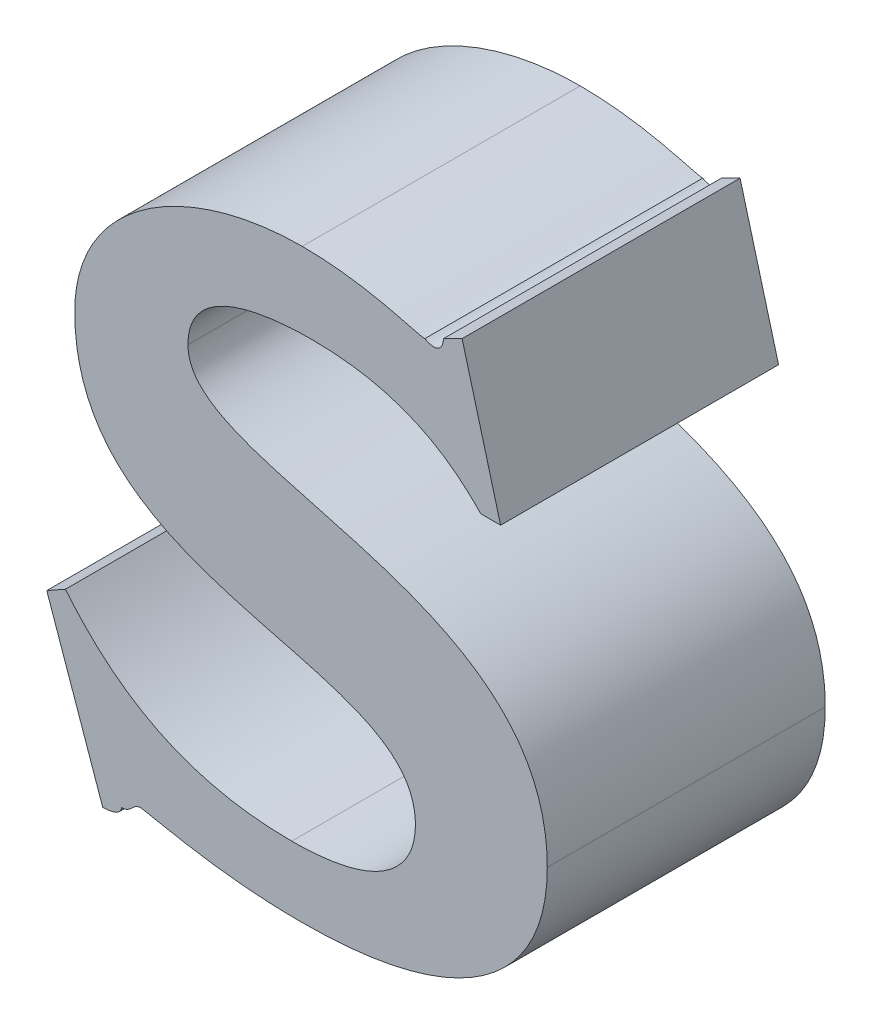
ISO-10303-21;
HEADER;
FILE_DESCRIPTION(('STEP AP214'),'2;1');
FILE_NAME('part.step','',(''),(''),'','','');
FILE_SCHEMA(('AUTOMOTIVE_DESIGN { 1 0 10303 214 1 1 1 1 }'));
ENDSEC;
DATA;
#1=APPLICATION_CONTEXT('core data for automotive mechanical design processes');
#2=APPLICATION_PROTOCOL_DEFINITION('international standard','automotive_design',2000,#1);
#3=PRODUCT_CONTEXT('',#1,'mechanical');
#4=PRODUCT('Part','Part','',(#3));
#5=PRODUCT_RELATED_PRODUCT_CATEGORY('part','',(#4));
#6=PRODUCT_DEFINITION_FORMATION('','',#4);
#7=PRODUCT_DEFINITION_CONTEXT('part definition',#1,'design');
#8=PRODUCT_DEFINITION('design','',#6,#7);
#9=PRODUCT_DEFINITION_SHAPE('','',#8);
#10=(LENGTH_UNIT() NAMED_UNIT(*) SI_UNIT(.MILLI.,.METRE.));
#11=(NAMED_UNIT(*) PLANE_ANGLE_UNIT() SI_UNIT($,.RADIAN.));
#12=(NAMED_UNIT(*) SI_UNIT($,.STERADIAN.) SOLID_ANGLE_UNIT());
#13=UNCERTAINTY_MEASURE_WITH_UNIT(LENGTH_MEASURE(1.E-05),#10,'distance_accuracy_value','');
#14=(GEOMETRIC_REPRESENTATION_CONTEXT(3) GLOBAL_UNCERTAINTY_ASSIGNED_CONTEXT((#13)) GLOBAL_UNIT_ASSIGNED_CONTEXT((#10,
#11,#12)) REPRESENTATION_CONTEXT('',''));
#15=CARTESIAN_POINT('',(0.,0.,0.));
#16=DIRECTION('',(0.,0.,1.));
#17=DIRECTION('',(1.,0.,0.));
#18=AXIS2_PLACEMENT_3D('',#15,#16,#17);
#19=CARTESIAN_POINT('',(1.246782857483,-0.437070394844,0.));
#20=CARTESIAN_POINT('',(1.246782857483,-0.437070394844,0.1));
#21=CARTESIAN_POINT('',(1.206070702821,-0.437070394844,0.));
#22=CARTESIAN_POINT('',(1.206070702821,-0.437070394844,0.1));
#23=CARTESIAN_POINT('',(1.182147203831,-0.419862014982,0.));
#24=CARTESIAN_POINT('',(1.182147203831,-0.419862014982,0.1));
#25=CARTESIAN_POINT('',(1.165358236212,-0.399295841595,0.));
#26=CARTESIAN_POINT('',(1.165358236212,-0.399295841595,0.1));
#27=B_SPLINE_SURFACE_WITH_KNOTS('',3,1,((#19,#20),(#21,#22),(#23,#24),(#25,#26)),.UNSPECIFIED.,
.F.,.F.,.F.,(4,4),(2,2),(-1.,0.),(0.,0.01),.UNSPECIFIED.);
#28=CARTESIAN_POINT('',(1.165358236212,-0.399295841595,0.));
#29=CARTESIAN_POINT('',(1.182147203831,-0.419862014982,0.));
#30=CARTESIAN_POINT('',(1.206070702821,-0.437070394844,0.));
#31=CARTESIAN_POINT('',(1.246782857483,-0.437070394844,0.));
#32=B_SPLINE_CURVE_WITH_KNOTS('',3,(#28,#29,#30,#31),.UNSPECIFIED.,.F.,.F.,(4,4),(0.,1.),.UNSPECIFIED.);
#33=CARTESIAN_POINT('',(1.165358236212,-0.399295841595,0.));
#34=VERTEX_POINT('',#33);
#35=CARTESIAN_POINT('',(1.246782857483,-0.437070394844,0.));
#36=VERTEX_POINT('',#35);
#37=EDGE_CURVE('E11',#34,#36,#32,.T.);
#38=DIRECTION('',(0.,0.,1.));
#39=VECTOR('',#38,1.);
#40=CARTESIAN_POINT('',(1.165358236212,-0.399295841595,0.));
#41=LINE('',#40,#39);
#42=CARTESIAN_POINT('',(1.165358236212,-0.399295841595,0.1));
#43=VERTEX_POINT('',#42);
#44=EDGE_CURVE('E28',#34,#43,#41,.T.);
#45=CARTESIAN_POINT('',(1.246782857483,-0.437070394844,0.1));
#46=CARTESIAN_POINT('',(1.206070702821,-0.437070394844,0.1));
#47=CARTESIAN_POINT('',(1.182147203831,-0.419862014982,0.1));
#48=CARTESIAN_POINT('',(1.165358236212,-0.399295841595,0.1));
#49=B_SPLINE_CURVE_WITH_KNOTS('',3,(#45,#46,#47,#48),.UNSPECIFIED.,.F.,.F.,(4,4),(-1.,0.),.UNSPECIFIED.);
#50=CARTESIAN_POINT('',(1.246782857483,-0.437070394844,0.1));
#51=VERTEX_POINT('',#50);
#52=EDGE_CURVE('E164',#51,#43,#49,.T.);
#53=DIRECTION('',(0.,0.,1.));
#54=VECTOR('',#53,1.);
#55=CARTESIAN_POINT('',(1.246782857483,-0.437070394844,0.));
#56=LINE('',#55,#54);
#57=EDGE_CURVE('E402',#36,#51,#56,.T.);
#58=ORIENTED_EDGE('',*,*,#37,.F.);
#59=ORIENTED_EDGE('',*,*,#44,.T.);
#60=ORIENTED_EDGE('',*,*,#52,.F.);
#61=ORIENTED_EDGE('',*,*,#57,.F.);
#62=EDGE_LOOP('',(#58,#59,#60,#61));
#63=FACE_BOUND('',#62,.T.);
#64=ADVANCED_FACE('F17',(#63),#27,.T.);
#65=CARTESIAN_POINT('',(1.291273621672,-0.409788852773,0.));
#66=CARTESIAN_POINT('',(1.291273621672,-0.409788852773,0.1));
#67=CARTESIAN_POINT('',(1.291273621672,-0.423219683727,0.));
#68=CARTESIAN_POINT('',(1.291273621672,-0.423219683727,0.1));
#69=CARTESIAN_POINT('',(1.280780984831,-0.437070394844,0.));
#70=CARTESIAN_POINT('',(1.280780984831,-0.437070394844,0.1));
#71=CARTESIAN_POINT('',(1.246782857483,-0.437070394844,0.));
#72=CARTESIAN_POINT('',(1.246782857483,-0.437070394844,0.1));
#73=B_SPLINE_SURFACE_WITH_KNOTS('',3,1,((#65,#66),(#67,#68),(#69,#70),(#71,#72)),.UNSPECIFIED.,
.F.,.F.,.F.,(4,4),(2,2),(-1.,0.),(0.,0.01),.UNSPECIFIED.);
#74=CARTESIAN_POINT('',(1.246782857483,-0.437070394844,0.));
#75=CARTESIAN_POINT('',(1.280780984831,-0.437070394844,0.));
#76=CARTESIAN_POINT('',(1.291273621672,-0.423219683727,0.));
#77=CARTESIAN_POINT('',(1.291273621672,-0.409788852773,0.));
#78=B_SPLINE_CURVE_WITH_KNOTS('',3,(#74,#75,#76,#77),.UNSPECIFIED.,.F.,.F.,(4,4),(0.,1.),.UNSPECIFIED.);
#79=CARTESIAN_POINT('',(1.291273621672,-0.409788852773,0.));
#80=VERTEX_POINT('',#79);
#81=EDGE_CURVE('E395',#36,#80,#78,.T.);
#82=CARTESIAN_POINT('',(1.291273621672,-0.409788852773,0.1));
#83=CARTESIAN_POINT('',(1.291273621672,-0.423219683727,0.1));
#84=CARTESIAN_POINT('',(1.280780984831,-0.437070394844,0.1));
#85=CARTESIAN_POINT('',(1.246782857483,-0.437070394844,0.1));
#86=B_SPLINE_CURVE_WITH_KNOTS('',3,(#82,#83,#84,#85),.UNSPECIFIED.,.F.,.F.,(4,4),(-1.,0.),.UNSPECIFIED.);
#87=CARTESIAN_POINT('',(1.291273621672,-0.409788852773,0.1));
#88=VERTEX_POINT('',#87);
#89=EDGE_CURVE('E391',#88,#51,#86,.T.);
#90=DIRECTION('',(0.,0.,1.));
#91=VECTOR('',#90,1.);
#92=CARTESIAN_POINT('',(1.291273621672,-0.409788852773,0.));
#93=LINE('',#92,#91);
#94=EDGE_CURVE('E385',#80,#88,#93,.T.);
#95=ORIENTED_EDGE('',*,*,#81,.F.);
#96=ORIENTED_EDGE('',*,*,#57,.T.);
#97=ORIENTED_EDGE('',*,*,#89,.F.);
#98=ORIENTED_EDGE('',*,*,#94,.F.);
#99=EDGE_LOOP('',(#95,#96,#97,#98));
#100=FACE_BOUND('',#99,.T.);
#101=ADVANCED_FACE('F472',(#100),#73,.T.);
#102=CARTESIAN_POINT('',(1.168716653629,-0.311155446109,0.));
#103=CARTESIAN_POINT('',(1.168716653629,-0.311155446109,0.1));
#104=CARTESIAN_POINT('',(1.168716653629,-0.392580472911,0.));
#105=CARTESIAN_POINT('',(1.168716653629,-0.392580472911,0.1));
#106=CARTESIAN_POINT('',(1.291273621672,-0.361941106121,0.));
#107=CARTESIAN_POINT('',(1.291273621672,-0.361941106121,0.1));
#108=CARTESIAN_POINT('',(1.291273621672,-0.409788852773,0.));
#109=CARTESIAN_POINT('',(1.291273621672,-0.409788852773,0.1));
#110=B_SPLINE_SURFACE_WITH_KNOTS('',3,1,((#102,#103),(#104,#105),(#106,#107),(#108,#109)),
.UNSPECIFIED.,.F.,.F.,.F.,(4,4),(2,2),(-1.,0.),(0.,0.01),.UNSPECIFIED.);
#111=CARTESIAN_POINT('',(1.291273621672,-0.409788852773,0.));
#112=CARTESIAN_POINT('',(1.291273621672,-0.361941106121,0.));
#113=CARTESIAN_POINT('',(1.168716653629,-0.392580472911,0.));
#114=CARTESIAN_POINT('',(1.168716653629,-0.311155446109,0.));
#115=B_SPLINE_CURVE_WITH_KNOTS('',3,(#111,#112,#113,#114),.UNSPECIFIED.,.F.,.F.,(4,4),(0.,1.),.UNSPECIFIED.);
#116=CARTESIAN_POINT('',(1.168716653629,-0.311155446109,0.));
#117=VERTEX_POINT('',#116);
#118=EDGE_CURVE('E378',#80,#117,#115,.T.);
#119=CARTESIAN_POINT('',(1.168716653629,-0.311155446109,0.1));
#120=CARTESIAN_POINT('',(1.168716653629,-0.392580472911,0.1));
#121=CARTESIAN_POINT('',(1.291273621672,-0.361941106121,0.1));
#122=CARTESIAN_POINT('',(1.291273621672,-0.409788852773,0.1));
#123=B_SPLINE_CURVE_WITH_KNOTS('',3,(#119,#120,#121,#122),.UNSPECIFIED.,.F.,.F.,(4,4),(-1.,0.),.UNSPECIFIED.);
#124=CARTESIAN_POINT('',(1.168716653629,-0.311155446109,0.1));
#125=VERTEX_POINT('',#124);
#126=EDGE_CURVE('E373',#125,#88,#123,.T.);
#127=DIRECTION('',(0.,0.,1.));
#128=VECTOR('',#127,1.);
#129=CARTESIAN_POINT('',(1.168716653629,-0.311155446109,0.));
#130=LINE('',#129,#128);
#131=EDGE_CURVE('E367',#117,#125,#130,.T.);
#132=ORIENTED_EDGE('',*,*,#118,.F.);
#133=ORIENTED_EDGE('',*,*,#94,.T.);
#134=ORIENTED_EDGE('',*,*,#126,.F.);
#135=ORIENTED_EDGE('',*,*,#131,.F.);
#136=EDGE_LOOP('',(#132,#133,#134,#135));
#137=FACE_BOUND('',#136,.T.);
#138=ADVANCED_FACE('F468',(#137),#110,.T.);
#139=CARTESIAN_POINT('',(1.250561155064,-0.24987686850389,0.));
#140=CARTESIAN_POINT('',(1.250561155064,-0.24987686850389,0.1));
#141=CARTESIAN_POINT('',(1.209428808291,-0.24987686850389,0.));
#142=CARTESIAN_POINT('',(1.209428808291,-0.24987686850389,0.1));
#143=CARTESIAN_POINT('',(1.168716653629,-0.27380058585652,0.));
#144=CARTESIAN_POINT('',(1.168716653629,-0.27380058585652,0.1));
#145=CARTESIAN_POINT('',(1.168716653629,-0.311155446109,0.));
#146=CARTESIAN_POINT('',(1.168716653629,-0.311155446109,0.1));
#147=B_SPLINE_SURFACE_WITH_KNOTS('',3,1,((#139,#140),(#141,#142),(#143,#144),(#145,#146)),
.UNSPECIFIED.,.F.,.F.,.F.,(4,4),(2,2),(-1.,0.),(0.,0.01),.UNSPECIFIED.);
#148=CARTESIAN_POINT('',(1.168716653629,-0.311155446109,0.));
#149=CARTESIAN_POINT('',(1.168716653629,-0.27380058585652,0.));
#150=CARTESIAN_POINT('',(1.209428808291,-0.24987686850389,0.));
#151=CARTESIAN_POINT('',(1.250561155064,-0.24987686850389,0.));
#152=B_SPLINE_CURVE_WITH_KNOTS('',3,(#148,#149,#150,#151),.UNSPECIFIED.,.F.,.F.,(4,4),(0.,1.),.UNSPECIFIED.);
#153=CARTESIAN_POINT('',(1.250561155064,-0.24987686850389,0.));
#154=VERTEX_POINT('',#153);
#155=EDGE_CURVE('E360',#117,#154,#152,.T.);
#156=CARTESIAN_POINT('',(1.250561155064,-0.24987686850389,0.1));
#157=CARTESIAN_POINT('',(1.209428808291,-0.24987686850389,0.1));
#158=CARTESIAN_POINT('',(1.168716653629,-0.27380058585652,0.1));
#159=CARTESIAN_POINT('',(1.168716653629,-0.311155446109,0.1));
#160=B_SPLINE_CURVE_WITH_KNOTS('',3,(#156,#157,#158,#159),.UNSPECIFIED.,.F.,.F.,(4,4),(-1.,0.),.UNSPECIFIED.);
#161=CARTESIAN_POINT('',(1.250561155064,-0.24987686850389,0.1));
#162=VERTEX_POINT('',#161);
#163=EDGE_CURVE('E355',#162,#125,#160,.T.);
#164=DIRECTION('',(0.,0.,1.));
#165=VECTOR('',#164,1.);
#166=CARTESIAN_POINT('',(1.250561155064,-0.24987686850389,0.));
#167=LINE('',#166,#165);
#168=EDGE_CURVE('E349',#154,#162,#167,.T.);
#169=ORIENTED_EDGE('',*,*,#155,.F.);
#170=ORIENTED_EDGE('',*,*,#131,.T.);
#171=ORIENTED_EDGE('',*,*,#163,.F.);
#172=ORIENTED_EDGE('',*,*,#168,.F.);
#173=EDGE_LOOP('',(#169,#170,#171,#172));
#174=FACE_BOUND('',#173,.T.);
#175=ADVANCED_FACE('F464',(#174),#147,.T.);
#176=CARTESIAN_POINT('',(1.294630479356,-0.2565923307727,0.));
#177=CARTESIAN_POINT('',(1.294630479356,-0.2565923307727,0.1));
#178=CARTESIAN_POINT('',(1.291273621672,-0.2565923307727,0.));
#179=CARTESIAN_POINT('',(1.291273621672,-0.2565923307727,0.1));
#180=CARTESIAN_POINT('',(1.274064461943,-0.24987686850389,0.));
#181=CARTESIAN_POINT('',(1.274064461943,-0.24987686850389,0.1));
#182=CARTESIAN_POINT('',(1.250561155064,-0.24987686850389,0.));
#183=CARTESIAN_POINT('',(1.250561155064,-0.24987686850389,0.1));
#184=B_SPLINE_SURFACE_WITH_KNOTS('',3,1,((#176,#177),(#178,#179),(#180,#181),(#182,#183)),
.UNSPECIFIED.,.F.,.F.,.F.,(4,4),(2,2),(-1.,0.),(0.,0.01),.UNSPECIFIED.);
#185=CARTESIAN_POINT('',(1.250561155064,-0.24987686850389,0.));
#186=CARTESIAN_POINT('',(1.274064461943,-0.24987686850389,0.));
#187=CARTESIAN_POINT('',(1.291273621672,-0.2565923307727,0.));
#188=CARTESIAN_POINT('',(1.294630479356,-0.2565923307727,0.));
#189=B_SPLINE_CURVE_WITH_KNOTS('',3,(#185,#186,#187,#188),.UNSPECIFIED.,.F.,.F.,(4,4),(0.,1.),.UNSPECIFIED.);
#190=CARTESIAN_POINT('',(1.294630479356,-0.2565923307727,0.));
#191=VERTEX_POINT('',#190);
#192=EDGE_CURVE('E342',#154,#191,#189,.T.);
#193=CARTESIAN_POINT('',(1.294630479356,-0.2565923307727,0.1));
#194=CARTESIAN_POINT('',(1.291273621672,-0.2565923307727,0.1));
#195=CARTESIAN_POINT('',(1.274064461943,-0.24987686850389,0.1));
#196=CARTESIAN_POINT('',(1.250561155064,-0.24987686850389,0.1));
#197=B_SPLINE_CURVE_WITH_KNOTS('',3,(#193,#194,#195,#196),.UNSPECIFIED.,.F.,.F.,(4,4),(-1.,0.),.UNSPECIFIED.);
#198=CARTESIAN_POINT('',(1.294630479356,-0.2565923307727,0.1));
#199=VERTEX_POINT('',#198);
#200=EDGE_CURVE('E337',#199,#162,#197,.T.);
#201=DIRECTION('',(0.,0.,1.));
#202=VECTOR('',#201,1.);
#203=CARTESIAN_POINT('',(1.294630479356,-0.2565923307727,0.));
#204=LINE('',#203,#202);
#205=EDGE_CURVE('E331',#191,#199,#204,.T.);
#206=ORIENTED_EDGE('',*,*,#192,.F.);
#207=ORIENTED_EDGE('',*,*,#168,.T.);
#208=ORIENTED_EDGE('',*,*,#200,.F.);
#209=ORIENTED_EDGE('',*,*,#205,.F.);
#210=EDGE_LOOP('',(#206,#207,#208,#209));
#211=FACE_BOUND('',#210,.T.);
#212=ADVANCED_FACE('F460',(#211),#184,.T.);
#213=CARTESIAN_POINT('',(1.301346066404,-0.25323453724898,0.));
#214=CARTESIAN_POINT('',(1.301346066404,-0.25323453724898,0.1));
#215=CARTESIAN_POINT('',(1.301346066404,-0.25328453724898,0.));
#216=CARTESIAN_POINT('',(1.301346066404,-0.25328453724898,0.1));
#217=CARTESIAN_POINT('',(1.301346066404,-0.25995003071244,0.));
#218=CARTESIAN_POINT('',(1.301346066404,-0.25995003071244,0.1));
#219=CARTESIAN_POINT('',(1.294630479356,-0.2565923307727,0.));
#220=CARTESIAN_POINT('',(1.294630479356,-0.2565923307727,0.1));
#221=B_SPLINE_SURFACE_WITH_KNOTS('',3,1,((#213,#214),(#215,#216),(#217,#218),(#219,#220)),
.UNSPECIFIED.,.F.,.F.,.F.,(4,4),(2,2),(-1.,0.),(0.,0.01),.UNSPECIFIED.);
#222=CARTESIAN_POINT('',(1.294630479356,-0.2565923307727,0.));
#223=CARTESIAN_POINT('',(1.301346066404,-0.25995003071244,0.));
#224=CARTESIAN_POINT('',(1.301346066404,-0.25328453724898,0.));
#225=CARTESIAN_POINT('',(1.301346066404,-0.25323453724898,0.));
#226=B_SPLINE_CURVE_WITH_KNOTS('',3,(#222,#223,#224,#225),.UNSPECIFIED.,.F.,.F.,(4,4),(0.,1.),.UNSPECIFIED.);
#227=CARTESIAN_POINT('',(1.301346066404,-0.25323453724898,0.));
#228=VERTEX_POINT('',#227);
#229=EDGE_CURVE('E324',#191,#228,#226,.T.);
#230=CARTESIAN_POINT('',(1.301346066404,-0.25323453724898,0.1));
#231=CARTESIAN_POINT('',(1.301346066404,-0.25328453724898,0.1));
#232=CARTESIAN_POINT('',(1.301346066404,-0.25995003071244,0.1));
#233=CARTESIAN_POINT('',(1.294630479356,-0.2565923307727,0.1));
#234=B_SPLINE_CURVE_WITH_KNOTS('',3,(#230,#231,#232,#233),.UNSPECIFIED.,.F.,.F.,(4,4),(-1.,0.),.UNSPECIFIED.);
#235=CARTESIAN_POINT('',(1.301346066404,-0.25323453724898,0.1));
#236=VERTEX_POINT('',#235);
#237=EDGE_CURVE('E319',#236,#199,#234,.T.);
#238=DIRECTION('',(0.,0.,1.));
#239=VECTOR('',#238,1.);
#240=CARTESIAN_POINT('',(1.301346066404,-0.25323453724898,0.));
#241=LINE('',#240,#239);
#242=EDGE_CURVE('E316',#228,#236,#241,.T.);
#243=ORIENTED_EDGE('',*,*,#229,.F.);
#244=ORIENTED_EDGE('',*,*,#205,.T.);
#245=ORIENTED_EDGE('',*,*,#237,.F.);
#246=ORIENTED_EDGE('',*,*,#242,.F.);
#247=EDGE_LOOP('',(#243,#244,#245,#246));
#248=FACE_BOUND('',#247,.T.);
#249=ADVANCED_FACE('F456',(#248),#221,.T.);
#250=CARTESIAN_POINT('',(1.308062589291,-0.24987686850389,0.));
#251=DIRECTION('',(-0.447150449279395,0.894458761323984,0.));
#252=DIRECTION('',(-0.894458761323984,-0.447150449279395,0.));
#253=AXIS2_PLACEMENT_3D('',#250,#251,#252);
#254=PLANE('',#253);
#255=DIRECTION('',(0.894458761323984,0.447150449279395,0.));
#256=VECTOR('',#255,1.);
#257=CARTESIAN_POINT('',(1.301346066404,-0.25323453724898,0.));
#258=LINE('',#257,#256);
#259=CARTESIAN_POINT('',(1.308062589291,-0.24987686850389,0.));
#260=VERTEX_POINT('',#259);
#261=EDGE_CURVE('E314',#228,#260,#258,.T.);
#262=ORIENTED_EDGE('',*,*,#261,.F.);
#263=ORIENTED_EDGE('',*,*,#242,.T.);
#264=DIRECTION('',(-0.894458761323984,-0.447150449279395,0.));
#265=VECTOR('',#264,1.);
#266=CARTESIAN_POINT('',(1.301346066404,-0.25323453724898,0.1));
#267=LINE('',#266,#265);
#268=CARTESIAN_POINT('',(1.308062589291,-0.24987686850389,0.1));
#269=VERTEX_POINT('',#268);
#270=EDGE_CURVE('E311',#269,#236,#267,.T.);
#271=ORIENTED_EDGE('',*,*,#270,.F.);
#272=DIRECTION('',(0.,0.,1.));
#273=VECTOR('',#272,1.);
#274=CARTESIAN_POINT('',(1.308062589291,-0.24987686850389,0.));
#275=LINE('',#274,#273);
#276=EDGE_CURVE('E308',#260,#269,#275,.T.);
#277=ORIENTED_EDGE('',*,*,#276,.F.);
#278=EDGE_LOOP('',(#262,#263,#271,#277));
#279=FACE_BOUND('',#278,.T.);
#280=ADVANCED_FACE('F452',(#279),#254,.T.);
#281=CARTESIAN_POINT('',(1.321912083816,-0.301082252706,0.));
#282=DIRECTION('',(0.965314937156601,0.261088245814223,0.));
#283=DIRECTION('',(-0.261088245814223,0.965314937156601,0.));
#284=AXIS2_PLACEMENT_3D('',#281,#282,#283);
#285=PLANE('',#284);
#286=DIRECTION('',(0.261088245814223,-0.965314937156601,0.));
#287=VECTOR('',#286,1.);
#288=CARTESIAN_POINT('',(1.308062589291,-0.24987686850389,0.));
#289=LINE('',#288,#287);
#290=CARTESIAN_POINT('',(1.321912083816,-0.301082252706,0.));
#291=VERTEX_POINT('',#290);
#292=EDGE_CURVE('E306',#260,#291,#289,.T.);
#293=ORIENTED_EDGE('',*,*,#292,.F.);
#294=ORIENTED_EDGE('',*,*,#276,.T.);
#295=DIRECTION('',(-0.261088245814223,0.965314937156601,0.));
#296=VECTOR('',#295,1.);
#297=CARTESIAN_POINT('',(1.308062589291,-0.24987686850389,0.1));
#298=LINE('',#297,#296);
#299=CARTESIAN_POINT('',(1.321912083816,-0.301082252706,0.1));
#300=VERTEX_POINT('',#299);
#301=EDGE_CURVE('E303',#300,#269,#298,.T.);
#302=ORIENTED_EDGE('',*,*,#301,.F.);
#303=DIRECTION('',(0.,0.,1.));
#304=VECTOR('',#303,1.);
#305=CARTESIAN_POINT('',(1.321912083816,-0.301082252706,0.));
#306=LINE('',#305,#304);
#307=EDGE_CURVE('E300',#291,#300,#306,.T.);
#308=ORIENTED_EDGE('',*,*,#307,.F.);
#309=EDGE_LOOP('',(#293,#294,#302,#308));
#310=FACE_BOUND('',#309,.T.);
#311=ADVANCED_FACE('F448',(#310),#285,.T.);
#312=CARTESIAN_POINT('',(1.314777864392,-0.301082252706,0.));
#313=DIRECTION('',(0.,-1.,0.));
#314=DIRECTION('',(1.,0.,0.));
#315=AXIS2_PLACEMENT_3D('',#312,#313,#314);
#316=PLANE('',#315);
#317=DIRECTION('',(-1.,0.,0.));
#318=VECTOR('',#317,1.);
#319=CARTESIAN_POINT('',(1.321912083816,-0.301082252706,0.));
#320=LINE('',#319,#318);
#321=CARTESIAN_POINT('',(1.314777864392,-0.301082252706,0.));
#322=VERTEX_POINT('',#321);
#323=EDGE_CURVE('E298',#291,#322,#320,.T.);
#324=ORIENTED_EDGE('',*,*,#323,.F.);
#325=ORIENTED_EDGE('',*,*,#307,.T.);
#326=DIRECTION('',(1.,0.,0.));
#327=VECTOR('',#326,1.);
#328=CARTESIAN_POINT('',(1.321912083816,-0.301082252706,0.1));
#329=LINE('',#328,#327);
#330=CARTESIAN_POINT('',(1.314777864392,-0.301082252706,0.1));
#331=VERTEX_POINT('',#330);
#332=EDGE_CURVE('E295',#331,#300,#329,.T.);
#333=ORIENTED_EDGE('',*,*,#332,.F.);
#334=DIRECTION('',(0.,0.,1.));
#335=VECTOR('',#334,1.);
#336=CARTESIAN_POINT('',(1.314777864392,-0.301082252706,0.));
#337=LINE('',#336,#335);
#338=EDGE_CURVE('E289',#322,#331,#337,.T.);
#339=ORIENTED_EDGE('',*,*,#338,.F.);
#340=EDGE_LOOP('',(#324,#325,#333,#339));
#341=FACE_BOUND('',#340,.T.);
#342=ADVANCED_FACE('F444',(#341),#316,.T.);
#343=CARTESIAN_POINT('',(1.253918324694,-0.27715841057491,0.));
#344=CARTESIAN_POINT('',(1.253918324694,-0.27715841057491,0.1));
#345=CARTESIAN_POINT('',(1.287915204255,-0.27715841057491,0.));
#346=CARTESIAN_POINT('',(1.287915204255,-0.27715841057491,0.1));
#347=CARTESIAN_POINT('',(1.304704171874,-0.29058936630718,0.));
#348=CARTESIAN_POINT('',(1.304704171874,-0.29058936630718,0.1));
#349=CARTESIAN_POINT('',(1.314777864392,-0.301082252706,0.));
#350=CARTESIAN_POINT('',(1.314777864392,-0.301082252706,0.1));
#351=B_SPLINE_SURFACE_WITH_KNOTS('',3,1,((#343,#344),(#345,#346),(#347,#348),(#349,#350)),
.UNSPECIFIED.,.F.,.F.,.F.,(4,4),(2,2),(-1.,0.),(0.,0.01),.UNSPECIFIED.);
#352=CARTESIAN_POINT('',(1.314777864392,-0.301082252706,0.));
#353=CARTESIAN_POINT('',(1.304704171874,-0.29058936630718,0.));
#354=CARTESIAN_POINT('',(1.287915204255,-0.27715841057491,0.));
#355=CARTESIAN_POINT('',(1.253918324694,-0.27715841057491,0.));
#356=B_SPLINE_CURVE_WITH_KNOTS('',3,(#352,#353,#354,#355),.UNSPECIFIED.,.F.,.F.,(4,4),(0.,1.),.UNSPECIFIED.);
#357=CARTESIAN_POINT('',(1.253918324694,-0.27715841057491,0.));
#358=VERTEX_POINT('',#357);
#359=EDGE_CURVE('E282',#322,#358,#356,.T.);
#360=CARTESIAN_POINT('',(1.253918324694,-0.27715841057491,0.1));
#361=CARTESIAN_POINT('',(1.287915204255,-0.27715841057491,0.1));
#362=CARTESIAN_POINT('',(1.304704171874,-0.29058936630718,0.1));
#363=CARTESIAN_POINT('',(1.314777864392,-0.301082252706,0.1));
#364=B_SPLINE_CURVE_WITH_KNOTS('',3,(#360,#361,#362,#363),.UNSPECIFIED.,.F.,.F.,(4,4),(-1.,0.),.UNSPECIFIED.);
#365=CARTESIAN_POINT('',(1.253918324694,-0.27715841057491,0.1));
#366=VERTEX_POINT('',#365);
#367=EDGE_CURVE('E277',#366,#331,#364,.T.);
#368=DIRECTION('',(0.,0.,1.));
#369=VECTOR('',#368,1.);
#370=CARTESIAN_POINT('',(1.253918324694,-0.27715841057491,0.));
#371=LINE('',#370,#369);
#372=EDGE_CURVE('E271',#358,#366,#371,.T.);
#373=ORIENTED_EDGE('',*,*,#359,.F.);
#374=ORIENTED_EDGE('',*,*,#338,.T.);
#375=ORIENTED_EDGE('',*,*,#367,.F.);
#376=ORIENTED_EDGE('',*,*,#372,.F.);
#377=EDGE_LOOP('',(#373,#374,#375,#376));
#378=FACE_BOUND('',#377,.T.);
#379=ADVANCED_FACE('F440',(#378),#351,.T.);
#380=CARTESIAN_POINT('',(1.209428808291,-0.301082252706,0.));
#381=CARTESIAN_POINT('',(1.209428808291,-0.301082252706,0.1));
#382=CARTESIAN_POINT('',(1.209428808291,-0.298786406476324,0.));
#383=CARTESIAN_POINT('',(1.209428808291,-0.298786406476324,0.1));
#384=CARTESIAN_POINT('',(1.209768784491,-0.296530058220637,0.));
#385=CARTESIAN_POINT('',(1.209768784491,-0.296530058220637,0.1));
#386=CARTESIAN_POINT('',(1.211267128479,-0.292402624477479,0.));
#387=CARTESIAN_POINT('',(1.211267128479,-0.292402624477479,0.1));
#388=CARTESIAN_POINT('',(1.212313177385,-0.290620592364899,0.));
#389=CARTESIAN_POINT('',(1.212313177385,-0.290620592364899,0.1));
#390=CARTESIAN_POINT('',(1.215625698097,-0.286676455644241,0.));
#391=CARTESIAN_POINT('',(1.215625698097,-0.286676455644241,0.1));
#392=CARTESIAN_POINT('',(1.218122922666,-0.284844283466083,0.));
#393=CARTESIAN_POINT('',(1.218122922666,-0.284844283466083,0.1));
#394=CARTESIAN_POINT('',(1.224647195102,-0.281343635094704,0.));
#395=CARTESIAN_POINT('',(1.224647195102,-0.281343635094704,0.1));
#396=CARTESIAN_POINT('',(1.22903511962,-0.279987378395416,0.));
#397=CARTESIAN_POINT('',(1.22903511962,-0.279987378395416,0.1));
#398=CARTESIAN_POINT('',(1.239908429045,-0.277674488270715,0.));
#399=CARTESIAN_POINT('',(1.239908429045,-0.277674488270715,0.1));
#400=CARTESIAN_POINT('',(1.247172006892,-0.27715841057491,0.));
#401=CARTESIAN_POINT('',(1.247172006892,-0.27715841057491,0.1));
#402=CARTESIAN_POINT('',(1.253918324694,-0.27715841057491,0.));
#403=CARTESIAN_POINT('',(1.253918324694,-0.27715841057491,0.1));
#404=B_SPLINE_SURFACE_WITH_KNOTS('',3,1,((#380,#381),(#382,#383),(#384,#385),(#386,#387),(#388,
#389),(#390,#391),(#392,#393),(#394,#395),(#396,#397),(#398,#399),(#400,#401),(#402,#403)),
.UNSPECIFIED.,.F.,.F.,.F.,(4,2,2,2,2,4),(2,2),(-0.005549290862653,-0.004863205913302,
-0.004237034328169,-0.003323896923552,-0.002023895340651,0.),(0.,0.01),.UNSPECIFIED.);
#405=CARTESIAN_POINT('',(1.253918324694,-0.27715841057491,0.));
#406=CARTESIAN_POINT('',(1.247172006892,-0.27715841057491,0.));
#407=CARTESIAN_POINT('',(1.239908429045,-0.277674488270715,0.));
#408=CARTESIAN_POINT('',(1.22903511962,-0.279987378395416,0.));
#409=CARTESIAN_POINT('',(1.224647195102,-0.281343635094704,0.));
#410=CARTESIAN_POINT('',(1.218122922666,-0.284844283466083,0.));
#411=CARTESIAN_POINT('',(1.215625698097,-0.286676455644241,0.));
#412=CARTESIAN_POINT('',(1.212313177385,-0.290620592364899,0.));
#413=CARTESIAN_POINT('',(1.211267128479,-0.292402624477479,0.));
#414=CARTESIAN_POINT('',(1.209768784491,-0.296530058220637,0.));
#415=CARTESIAN_POINT('',(1.209428808291,-0.298786406476324,0.));
#416=CARTESIAN_POINT('',(1.209428808291,-0.301082252706,0.));
#417=B_SPLINE_CURVE_WITH_KNOTS('',3,(#405,#406,#407,#408,#409,#410,#411,#412,#413,#414,#415,
#416),.UNSPECIFIED.,.F.,.F.,(4,2,2,2,2,4),(0.,0.002023895340651,0.003323896923552,
0.004237034328169,0.004863205913302,0.005549290862653),.UNSPECIFIED.);
#418=CARTESIAN_POINT('',(1.209428808291,-0.301082252706,0.));
#419=VERTEX_POINT('',#418);
#420=EDGE_CURVE('E264',#358,#419,#417,.T.);
#421=CARTESIAN_POINT('',(1.209428808291,-0.301082252706,0.1));
#422=CARTESIAN_POINT('',(1.209428808291,-0.298786406476324,0.1));
#423=CARTESIAN_POINT('',(1.209768784491,-0.296530058220637,0.1));
#424=CARTESIAN_POINT('',(1.211267128479,-0.292402624477479,0.1));
#425=CARTESIAN_POINT('',(1.212313177385,-0.290620592364899,0.1));
#426=CARTESIAN_POINT('',(1.215625698097,-0.286676455644241,0.1));
#427=CARTESIAN_POINT('',(1.218122922666,-0.284844283466083,0.1));
#428=CARTESIAN_POINT('',(1.224647195102,-0.281343635094704,0.1));
#429=CARTESIAN_POINT('',(1.22903511962,-0.279987378395416,0.1));
#430=CARTESIAN_POINT('',(1.239908429045,-0.277674488270715,0.1));
#431=CARTESIAN_POINT('',(1.247172006892,-0.27715841057491,0.1));
#432=CARTESIAN_POINT('',(1.253918324694,-0.27715841057491,0.1));
#433=B_SPLINE_CURVE_WITH_KNOTS('',3,(#421,#422,#423,#424,#425,#426,#427,#428,#429,#430,#431,
#432),.UNSPECIFIED.,.F.,.F.,(4,2,2,2,2,4),(-0.005549290862653,-0.004863205913302,
-0.004237034328169,-0.003323896923552,-0.002023895340651,0.),.UNSPECIFIED.);
#434=CARTESIAN_POINT('',(1.209428808291,-0.301082252706,0.1));
#435=VERTEX_POINT('',#434);
#436=EDGE_CURVE('E259',#435,#366,#433,.T.);
#437=DIRECTION('',(0.,0.,1.));
#438=VECTOR('',#437,1.);
#439=CARTESIAN_POINT('',(1.209428808291,-0.301082252706,0.));
#440=LINE('',#439,#438);
#441=EDGE_CURVE('E253',#419,#435,#440,.T.);
#442=ORIENTED_EDGE('',*,*,#420,.F.);
#443=ORIENTED_EDGE('',*,*,#372,.T.);
#444=ORIENTED_EDGE('',*,*,#436,.F.);
#445=ORIENTED_EDGE('',*,*,#441,.F.);
#446=EDGE_LOOP('',(#442,#443,#444,#445));
#447=FACE_BOUND('',#446,.T.);
#448=ADVANCED_FACE('F436',(#447),#404,.T.);
#449=CARTESIAN_POINT('',(1.338701051435,-0.399295841595,0.));
#450=CARTESIAN_POINT('',(1.338701051435,-0.399295841595,0.1));
#451=CARTESIAN_POINT('',(1.338701051435,-0.317870908378,0.));
#452=CARTESIAN_POINT('',(1.338701051435,-0.317870908378,0.1));
#453=CARTESIAN_POINT('',(1.209428808291,-0.33843698818,0.));
#454=CARTESIAN_POINT('',(1.209428808291,-0.33843698818,0.1));
#455=CARTESIAN_POINT('',(1.209428808291,-0.301082252706,0.));
#456=CARTESIAN_POINT('',(1.209428808291,-0.301082252706,0.1));
#457=B_SPLINE_SURFACE_WITH_KNOTS('',3,1,((#449,#450),(#451,#452),(#453,#454),(#455,#456)),
.UNSPECIFIED.,.F.,.F.,.F.,(4,4),(2,2),(-1.,0.),(0.,0.01),.UNSPECIFIED.);
#458=CARTESIAN_POINT('',(1.209428808291,-0.301082252706,0.));
#459=CARTESIAN_POINT('',(1.209428808291,-0.33843698818,0.));
#460=CARTESIAN_POINT('',(1.338701051435,-0.317870908378,0.));
#461=CARTESIAN_POINT('',(1.338701051435,-0.399295841595,0.));
#462=B_SPLINE_CURVE_WITH_KNOTS('',3,(#458,#459,#460,#461),.UNSPECIFIED.,.F.,.F.,(4,4),(0.,1.),.UNSPECIFIED.);
#463=CARTESIAN_POINT('',(1.338701051435,-0.399295841595,0.));
#464=VERTEX_POINT('',#463);
#465=EDGE_CURVE('E246',#419,#464,#462,.T.);
#466=CARTESIAN_POINT('',(1.338701051435,-0.399295841595,0.1));
#467=CARTESIAN_POINT('',(1.338701051435,-0.317870908378,0.1));
#468=CARTESIAN_POINT('',(1.209428808291,-0.33843698818,0.1));
#469=CARTESIAN_POINT('',(1.209428808291,-0.301082252706,0.1));
#470=B_SPLINE_CURVE_WITH_KNOTS('',3,(#466,#467,#468,#469),.UNSPECIFIED.,.F.,.F.,(4,4),(-1.,0.),.UNSPECIFIED.);
#471=CARTESIAN_POINT('',(1.338701051435,-0.399295841595,0.1));
#472=VERTEX_POINT('',#471);
#473=EDGE_CURVE('E241',#472,#435,#470,.T.);
#474=DIRECTION('',(0.,0.,1.));
#475=VECTOR('',#474,1.);
#476=CARTESIAN_POINT('',(1.338701051435,-0.399295841595,0.));
#477=LINE('',#476,#475);
#478=EDGE_CURVE('E235',#464,#472,#477,.T.);
#479=ORIENTED_EDGE('',*,*,#465,.F.);
#480=ORIENTED_EDGE('',*,*,#441,.T.);
#481=ORIENTED_EDGE('',*,*,#473,.F.);
#482=ORIENTED_EDGE('',*,*,#478,.F.);
#483=EDGE_LOOP('',(#479,#480,#481,#482));
#484=FACE_BOUND('',#483,.T.);
#485=ADVANCED_FACE('F432',(#484),#457,.T.);
#486=CARTESIAN_POINT('',(1.250561155064,-0.46057454398,0.));
#487=CARTESIAN_POINT('',(1.250561155064,-0.46057454398,0.1));
#488=CARTESIAN_POINT('',(1.264080463549,-0.46057454398,0.));
#489=CARTESIAN_POINT('',(1.264080463549,-0.46057454398,0.1));
#490=CARTESIAN_POINT('',(1.278163425277,-0.459275283778219,0.));
#491=CARTESIAN_POINT('',(1.278163425277,-0.459275283778219,0.1));
#492=CARTESIAN_POINT('',(1.299784509627,-0.453200727638474,0.));
#493=CARTESIAN_POINT('',(1.299784509627,-0.453200727638474,0.1));
#494=CARTESIAN_POINT('',(1.308218403476,-0.449653919331743,0.));
#495=CARTESIAN_POINT('',(1.308218403476,-0.449653919331743,0.1));
#496=CARTESIAN_POINT('',(1.321496204663,-0.440418384921308,0.));
#497=CARTESIAN_POINT('',(1.321496204663,-0.440418384921308,0.1));
#498=CARTESIAN_POINT('',(1.32657716411,-0.435374758730405,0.));
#499=CARTESIAN_POINT('',(1.32657716411,-0.435374758730405,0.1));
#500=CARTESIAN_POINT('',(1.33322593061,-0.424974978551544,0.));
#501=CARTESIAN_POINT('',(1.33322593061,-0.424974978551544,0.1));
#502=CARTESIAN_POINT('',(1.335268573658,-0.42030994829303,0.));
#503=CARTESIAN_POINT('',(1.335268573658,-0.42030994829303,0.1));
#504=CARTESIAN_POINT('',(1.338067613529,-0.410127346796959,0.));
#505=CARTESIAN_POINT('',(1.338067613529,-0.410127346796959,0.1));
#506=CARTESIAN_POINT('',(1.338701051435,-0.404727317782344,0.));
#507=CARTESIAN_POINT('',(1.338701051435,-0.404727317782344,0.1));
#508=CARTESIAN_POINT('',(1.338701051435,-0.399295841595,0.));
#509=CARTESIAN_POINT('',(1.338701051435,-0.399295841595,0.1));
#510=B_SPLINE_SURFACE_WITH_KNOTS('',3,1,((#486,#487),(#488,#489),(#490,#491),(#492,#493),(#494,
#495),(#496,#497),(#498,#499),(#500,#501),(#502,#503),(#504,#505),(#506,#507),(#508,#509)),
.UNSPECIFIED.,.F.,.F.,.F.,(4,2,2,2,2,4),(2,2),(-0.012061163958168,-0.008020391845531,
-0.005334335126616,-0.003169279171498,-0.001629442856203,0.),(0.,0.01),.UNSPECIFIED.);
#511=CARTESIAN_POINT('',(1.338701051435,-0.399295841595,0.));
#512=CARTESIAN_POINT('',(1.338701051435,-0.404727317782344,0.));
#513=CARTESIAN_POINT('',(1.338067613529,-0.410127346796959,0.));
#514=CARTESIAN_POINT('',(1.335268573658,-0.42030994829303,0.));
#515=CARTESIAN_POINT('',(1.33322593061,-0.424974978551544,0.));
#516=CARTESIAN_POINT('',(1.32657716411,-0.435374758730405,0.));
#517=CARTESIAN_POINT('',(1.321496204663,-0.440418384921308,0.));
#518=CARTESIAN_POINT('',(1.308218403476,-0.449653919331743,0.));
#519=CARTESIAN_POINT('',(1.299784509627,-0.453200727638474,0.));
#520=CARTESIAN_POINT('',(1.278163425277,-0.459275283778219,0.));
#521=CARTESIAN_POINT('',(1.264080463549,-0.46057454398,0.));
#522=CARTESIAN_POINT('',(1.250561155064,-0.46057454398,0.));
#523=B_SPLINE_CURVE_WITH_KNOTS('',3,(#511,#512,#513,#514,#515,#516,#517,#518,#519,#520,#521,
#522),.UNSPECIFIED.,.F.,.F.,(4,2,2,2,2,4),(0.,0.001629442856203,0.003169279171498,
0.005334335126616,0.008020391845531,0.012061163958168),.UNSPECIFIED.);
#524=CARTESIAN_POINT('',(1.250561155064,-0.46057454398,0.));
#525=VERTEX_POINT('',#524);
#526=EDGE_CURVE('E228',#464,#525,#523,.T.);
#527=CARTESIAN_POINT('',(1.250561155064,-0.46057454398,0.1));
#528=CARTESIAN_POINT('',(1.264080463549,-0.46057454398,0.1));
#529=CARTESIAN_POINT('',(1.278163425277,-0.459275283778219,0.1));
#530=CARTESIAN_POINT('',(1.299784509627,-0.453200727638474,0.1));
#531=CARTESIAN_POINT('',(1.308218403476,-0.449653919331743,0.1));
#532=CARTESIAN_POINT('',(1.321496204663,-0.440418384921308,0.1));
#533=CARTESIAN_POINT('',(1.32657716411,-0.435374758730405,0.1));
#534=CARTESIAN_POINT('',(1.33322593061,-0.424974978551544,0.1));
#535=CARTESIAN_POINT('',(1.335268573658,-0.42030994829303,0.1));
#536=CARTESIAN_POINT('',(1.338067613529,-0.410127346796959,0.1));
#537=CARTESIAN_POINT('',(1.338701051435,-0.404727317782344,0.1));
#538=CARTESIAN_POINT('',(1.338701051435,-0.399295841595,0.1));
#539=B_SPLINE_CURVE_WITH_KNOTS('',3,(#527,#528,#529,#530,#531,#532,#533,#534,#535,#536,#537,
#538),.UNSPECIFIED.,.F.,.F.,(4,2,2,2,2,4),(-0.012061163958168,-0.008020391845531,
-0.005334335126616,-0.003169279171498,-0.001629442856203,0.),.UNSPECIFIED.);
#540=CARTESIAN_POINT('',(1.250561155064,-0.46057454398,0.1));
#541=VERTEX_POINT('',#540);
#542=EDGE_CURVE('E223',#541,#472,#539,.T.);
#543=DIRECTION('',(0.,0.,1.));
#544=VECTOR('',#543,1.);
#545=CARTESIAN_POINT('',(1.250561155064,-0.46057454398,0.));
#546=LINE('',#545,#544);
#547=EDGE_CURVE('E217',#525,#541,#546,.T.);
#548=ORIENTED_EDGE('',*,*,#526,.F.);
#549=ORIENTED_EDGE('',*,*,#478,.T.);
#550=ORIENTED_EDGE('',*,*,#542,.F.);
#551=ORIENTED_EDGE('',*,*,#547,.F.);
#552=EDGE_LOOP('',(#548,#549,#550,#551));
#553=FACE_BOUND('',#552,.T.);
#554=ADVANCED_FACE('F428',(#553),#510,.T.);
#555=CARTESIAN_POINT('',(1.192639840673,-0.453859050516,0.));
#556=CARTESIAN_POINT('',(1.192639840673,-0.453859050516,0.1));
#557=CARTESIAN_POINT('',(1.209428808291,-0.457216719261,0.));
#558=CARTESIAN_POINT('',(1.209428808291,-0.457216719261,0.1));
#559=CARTESIAN_POINT('',(1.226636720234,-0.46057454398,0.));
#560=CARTESIAN_POINT('',(1.226636720234,-0.46057454398,0.1));
#561=CARTESIAN_POINT('',(1.250561155064,-0.46057454398,0.));
#562=CARTESIAN_POINT('',(1.250561155064,-0.46057454398,0.1));
#563=B_SPLINE_SURFACE_WITH_KNOTS('',3,1,((#555,#556),(#557,#558),(#559,#560),(#561,#562)),
.UNSPECIFIED.,.F.,.F.,.F.,(4,4),(2,2),(-1.,0.),(0.,0.01),.UNSPECIFIED.);
#564=CARTESIAN_POINT('',(1.250561155064,-0.46057454398,0.));
#565=CARTESIAN_POINT('',(1.226636720234,-0.46057454398,0.));
#566=CARTESIAN_POINT('',(1.209428808291,-0.457216719261,0.));
#567=CARTESIAN_POINT('',(1.192639840673,-0.453859050516,0.));
#568=B_SPLINE_CURVE_WITH_KNOTS('',3,(#564,#565,#566,#567),.UNSPECIFIED.,.F.,.F.,(4,4),(0.,1.),.UNSPECIFIED.);
#569=CARTESIAN_POINT('',(1.192639840673,-0.453859050516,0.));
#570=VERTEX_POINT('',#569);
#571=EDGE_CURVE('E210',#525,#570,#568,.T.);
#572=CARTESIAN_POINT('',(1.192639840673,-0.453859050516,0.1));
#573=CARTESIAN_POINT('',(1.209428808291,-0.457216719261,0.1));
#574=CARTESIAN_POINT('',(1.226636720234,-0.46057454398,0.1));
#575=CARTESIAN_POINT('',(1.250561155064,-0.46057454398,0.1));
#576=B_SPLINE_CURVE_WITH_KNOTS('',3,(#572,#573,#574,#575),.UNSPECIFIED.,.F.,.F.,(4,4),(-1.,0.),.UNSPECIFIED.);
#577=CARTESIAN_POINT('',(1.192639840673,-0.453859050516,0.1));
#578=VERTEX_POINT('',#577);
#579=EDGE_CURVE('E205',#578,#541,#576,.T.);
#580=DIRECTION('',(0.,0.,1.));
#581=VECTOR('',#580,1.);
#582=CARTESIAN_POINT('',(1.192639840673,-0.453859050516,0.));
#583=LINE('',#582,#581);
#584=EDGE_CURVE('E199',#570,#578,#583,.T.);
#585=ORIENTED_EDGE('',*,*,#571,.F.);
#586=ORIENTED_EDGE('',*,*,#547,.T.);
#587=ORIENTED_EDGE('',*,*,#579,.F.);
#588=ORIENTED_EDGE('',*,*,#584,.F.);
#589=EDGE_LOOP('',(#585,#586,#587,#588));
#590=FACE_BOUND('',#589,.T.);
#591=ADVANCED_FACE('F424',(#590),#563,.T.);
#592=CARTESIAN_POINT('',(1.185504373461,-0.457216719261,0.));
#593=CARTESIAN_POINT('',(1.185504373461,-0.457216719261,0.1));
#594=CARTESIAN_POINT('',(1.189282671042,-0.457216719261,0.));
#595=CARTESIAN_POINT('',(1.189282671042,-0.457216719261,0.1));
#596=CARTESIAN_POINT('',(1.189282671042,-0.453859050516,0.));
#597=CARTESIAN_POINT('',(1.189282671042,-0.453859050516,0.1));
#598=CARTESIAN_POINT('',(1.192639840673,-0.453859050516,0.));
#599=CARTESIAN_POINT('',(1.192639840673,-0.453859050516,0.1));
#600=B_SPLINE_SURFACE_WITH_KNOTS('',3,1,((#592,#593),(#594,#595),(#596,#597),(#598,#599)),
.UNSPECIFIED.,.F.,.F.,.F.,(4,4),(2,2),(-1.,0.),(0.,0.01),.UNSPECIFIED.);
#601=CARTESIAN_POINT('',(1.192639840673,-0.453859050516,0.));
#602=CARTESIAN_POINT('',(1.189282671042,-0.453859050516,0.));
#603=CARTESIAN_POINT('',(1.189282671042,-0.457216719261,0.));
#604=CARTESIAN_POINT('',(1.185504373461,-0.457216719261,0.));
#605=B_SPLINE_CURVE_WITH_KNOTS('',3,(#601,#602,#603,#604),.UNSPECIFIED.,.F.,.F.,(4,4),(0.,1.),.UNSPECIFIED.);
#606=CARTESIAN_POINT('',(1.185504373461,-0.457216719261,0.));
#607=VERTEX_POINT('',#606);
#608=EDGE_CURVE('E192',#570,#607,#605,.T.);
#609=CARTESIAN_POINT('',(1.185504373461,-0.457216719261,0.1));
#610=CARTESIAN_POINT('',(1.189282671042,-0.457216719261,0.1));
#611=CARTESIAN_POINT('',(1.189282671042,-0.453859050516,0.1));
#612=CARTESIAN_POINT('',(1.192639840673,-0.453859050516,0.1));
#613=B_SPLINE_CURVE_WITH_KNOTS('',3,(#609,#610,#611,#612),.UNSPECIFIED.,.F.,.F.,(4,4),(-1.,0.),.UNSPECIFIED.);
#614=CARTESIAN_POINT('',(1.185504373461,-0.457216719261,0.1));
#615=VERTEX_POINT('',#614);
#616=EDGE_CURVE('E187',#615,#578,#613,.T.);
#617=DIRECTION('',(0.,0.,1.));
#618=VECTOR('',#617,1.);
#619=CARTESIAN_POINT('',(1.185504373461,-0.457216719261,0.));
#620=LINE('',#619,#618);
#621=EDGE_CURVE('E181',#607,#615,#620,.T.);
#622=ORIENTED_EDGE('',*,*,#608,.F.);
#623=ORIENTED_EDGE('',*,*,#584,.T.);
#624=ORIENTED_EDGE('',*,*,#616,.F.);
#625=ORIENTED_EDGE('',*,*,#621,.F.);
#626=EDGE_LOOP('',(#622,#623,#624,#625));
#627=FACE_BOUND('',#626,.T.);
#628=ADVANCED_FACE('F420',(#627),#600,.T.);
#629=CARTESIAN_POINT('',(1.178789098361,-0.46057454398,0.));
#630=CARTESIAN_POINT('',(1.178789098361,-0.46057454398,0.1));
#631=CARTESIAN_POINT('',(1.178795326308,-0.46057454398,0.));
#632=CARTESIAN_POINT('',(1.178795326308,-0.46057454398,0.1));
#633=CARTESIAN_POINT('',(1.178826825265,-0.46057454398,0.));
#634=CARTESIAN_POINT('',(1.178826825265,-0.46057454398,0.1));
#635=CARTESIAN_POINT('',(1.178953459052,-0.460572627549199,0.));
#636=CARTESIAN_POINT('',(1.178953459052,-0.460572627549199,0.1));
#637=CARTESIAN_POINT('',(1.179029988957,-0.460570604401979,0.));
#638=CARTESIAN_POINT('',(1.179029988957,-0.460570604401979,0.1));
#639=CARTESIAN_POINT('',(1.179356372547,-0.460559413173337,0.));
#640=CARTESIAN_POINT('',(1.179356372547,-0.460559413173337,0.1));
#641=CARTESIAN_POINT('',(1.179617961697,-0.460543696611348,0.));
#642=CARTESIAN_POINT('',(1.179617961697,-0.460543696611348,0.1));
#643=CARTESIAN_POINT('',(1.180627855674,-0.46046055737336,0.));
#644=CARTESIAN_POINT('',(1.180627855674,-0.46046055737336,0.1));
#645=CARTESIAN_POINT('',(1.181426866846,-0.460344253276123,0.));
#646=CARTESIAN_POINT('',(1.181426866846,-0.460344253276123,0.1));
#647=CARTESIAN_POINT('',(1.182944235749,-0.459964751976291,0.));
#648=CARTESIAN_POINT('',(1.182944235749,-0.459964751976291,0.1));
#649=CARTESIAN_POINT('',(1.183788975982,-0.459662029971015,0.));
#650=CARTESIAN_POINT('',(1.183788975982,-0.459662029971015,0.1));
#651=CARTESIAN_POINT('',(1.184732561866,-0.458963238108627,0.));
#652=CARTESIAN_POINT('',(1.184732561866,-0.458963238108627,0.1));
#653=CARTESIAN_POINT('',(1.184997330301,-0.458697743901198,0.));
#654=CARTESIAN_POINT('',(1.184997330301,-0.458697743901198,0.1));
#655=CARTESIAN_POINT('',(1.185290489825,-0.458209081710265,0.));
#656=CARTESIAN_POINT('',(1.185290489825,-0.458209081710265,0.1));
#657=CARTESIAN_POINT('',(1.185368619045,-0.458029186516063,0.));
#658=CARTESIAN_POINT('',(1.185368619045,-0.458029186516063,0.1));
#659=CARTESIAN_POINT('',(1.185478283486,-0.457635549167783,0.));
#660=CARTESIAN_POINT('',(1.185478283486,-0.457635549167783,0.1));
#661=CARTESIAN_POINT('',(1.185504373461,-0.45742759222254,0.));
#662=CARTESIAN_POINT('',(1.185504373461,-0.45742759222254,0.1));
#663=CARTESIAN_POINT('',(1.185504373461,-0.457216719261,0.));
#664=CARTESIAN_POINT('',(1.185504373461,-0.457216719261,0.1));
#665=B_SPLINE_SURFACE_WITH_KNOTS('',3,1,((#629,#630),(#631,#632),(#633,#634),(#635,#636),(#637,
#638),(#639,#640),(#641,#642),(#643,#644),(#645,#646),(#647,#648),(#649,#650),(#651,#652),(#653,
#654),(#655,#656),(#657,#658),(#659,#660),(#661,#662),(#663,#664)),.UNSPECIFIED.,.F.,.F.,.F.,(4,
2,2,2,2,2,2,2,4),(2,2),(-0.000821272290072719,-0.000804451508597046,-0.000781530582016112,
-0.000703838184102362,-0.000474897934592123,-0.000234225254412616,-0.000122592335185653,
-6.32618884620199E-05,0.),(0.,0.01),.UNSPECIFIED.);
#666=CARTESIAN_POINT('',(1.185504373461,-0.457216719261,0.));
#667=CARTESIAN_POINT('',(1.185504373461,-0.45742759222254,0.));
#668=CARTESIAN_POINT('',(1.185478283486,-0.457635549167783,0.));
#669=CARTESIAN_POINT('',(1.185368619045,-0.458029186516063,0.));
#670=CARTESIAN_POINT('',(1.185290489825,-0.458209081710265,0.));
#671=CARTESIAN_POINT('',(1.184997330301,-0.458697743901198,0.));
#672=CARTESIAN_POINT('',(1.184732561866,-0.458963238108627,0.));
#673=CARTESIAN_POINT('',(1.183788975982,-0.459662029971015,0.));
#674=CARTESIAN_POINT('',(1.182944235749,-0.459964751976291,0.));
#675=CARTESIAN_POINT('',(1.181426866846,-0.460344253276123,0.));
#676=CARTESIAN_POINT('',(1.180627855674,-0.46046055737336,0.));
#677=CARTESIAN_POINT('',(1.179617961697,-0.460543696611348,0.));
#678=CARTESIAN_POINT('',(1.179356372547,-0.460559413173337,0.));
#679=CARTESIAN_POINT('',(1.179029988957,-0.460570604401979,0.));
#680=CARTESIAN_POINT('',(1.178953459052,-0.460572627549199,0.));
#681=CARTESIAN_POINT('',(1.178826825265,-0.46057454398,0.));
#682=CARTESIAN_POINT('',(1.178795326308,-0.46057454398,0.));
#683=CARTESIAN_POINT('',(1.178789098361,-0.46057454398,0.));
#684=B_SPLINE_CURVE_WITH_KNOTS('',3,(#666,#667,#668,#669,#670,#671,#672,#673,#674,#675,#676,
#677,#678,#679,#680,#681,#682,#683),.UNSPECIFIED.,.F.,.F.,(4,2,2,2,2,2,2,2,4),(0.,
6.32618884620199E-05,0.000122592335185653,0.000234225254412616,0.000474897934592123,
0.000703838184102362,0.000781530582016112,0.000804451508597046,0.000821272290072719),.UNSPECIFIED.);
#685=CARTESIAN_POINT('',(1.178789098361,-0.46057454398,0.));
#686=VERTEX_POINT('',#685);
#687=EDGE_CURVE('E174',#607,#686,#684,.T.);
#688=CARTESIAN_POINT('',(1.178789098361,-0.46057454398,0.1));
#689=CARTESIAN_POINT('',(1.178795326308,-0.46057454398,0.1));
#690=CARTESIAN_POINT('',(1.178826825265,-0.46057454398,0.1));
#691=CARTESIAN_POINT('',(1.178953459052,-0.460572627549199,0.1));
#692=CARTESIAN_POINT('',(1.179029988957,-0.460570604401979,0.1));
#693=CARTESIAN_POINT('',(1.179356372547,-0.460559413173337,0.1));
#694=CARTESIAN_POINT('',(1.179617961697,-0.460543696611348,0.1));
#695=CARTESIAN_POINT('',(1.180627855674,-0.46046055737336,0.1));
#696=CARTESIAN_POINT('',(1.181426866846,-0.460344253276123,0.1));
#697=CARTESIAN_POINT('',(1.182944235749,-0.459964751976291,0.1));
#698=CARTESIAN_POINT('',(1.183788975982,-0.459662029971015,0.1));
#699=CARTESIAN_POINT('',(1.184732561866,-0.458963238108627,0.1));
#700=CARTESIAN_POINT('',(1.184997330301,-0.458697743901198,0.1));
#701=CARTESIAN_POINT('',(1.185290489825,-0.458209081710265,0.1));
#702=CARTESIAN_POINT('',(1.185368619045,-0.458029186516063,0.1));
#703=CARTESIAN_POINT('',(1.185478283486,-0.457635549167783,0.1));
#704=CARTESIAN_POINT('',(1.185504373461,-0.45742759222254,0.1));
#705=CARTESIAN_POINT('',(1.185504373461,-0.457216719261,0.1));
#706=B_SPLINE_CURVE_WITH_KNOTS('',3,(#688,#689,#690,#691,#692,#693,#694,#695,#696,#697,#698,
#699,#700,#701,#702,#703,#704,#705),.UNSPECIFIED.,.F.,.F.,(4,2,2,2,2,2,2,2,4),
(-0.000821272290072719,-0.000804451508597046,-0.000781530582016112,-0.000703838184102362,
-0.000474897934592123,-0.000234225254412616,-0.000122592335185653,-6.32618884620199E-05,0.),.UNSPECIFIED.);
#707=CARTESIAN_POINT('',(1.178789098361,-0.46057454398,0.1));
#708=VERTEX_POINT('',#707);
#709=EDGE_CURVE('E170',#708,#615,#706,.T.);
#710=DIRECTION('',(0.,0.,1.));
#711=VECTOR('',#710,1.);
#712=CARTESIAN_POINT('',(1.178789098361,-0.46057454398,0.));
#713=LINE('',#712,#711);
#714=EDGE_CURVE('E149',#686,#708,#713,.T.);
#715=ORIENTED_EDGE('',*,*,#687,.F.);
#716=ORIENTED_EDGE('',*,*,#621,.T.);
#717=ORIENTED_EDGE('',*,*,#709,.F.);
#718=ORIENTED_EDGE('',*,*,#714,.F.);
#719=EDGE_LOOP('',(#715,#716,#717,#718));
#720=FACE_BOUND('',#719,.T.);
#721=ADVANCED_FACE('F418',(#720),#665,.T.);
#722=CARTESIAN_POINT('',(1.158642961111,-0.40307335931,0.));
#723=DIRECTION('',(-0.943752258512618,-0.33065340547518,0.));
#724=DIRECTION('',(0.33065340547518,-0.943752258512618,0.));
#725=AXIS2_PLACEMENT_3D('',#722,#723,#724);
#726=PLANE('',#725);
#727=DIRECTION('',(-0.33065340547518,0.943752258512617,0.));
#728=VECTOR('',#727,1.);
#729=CARTESIAN_POINT('',(1.178789098361,-0.46057454398,0.));
#730=LINE('',#729,#728);
#731=CARTESIAN_POINT('',(1.158642961111,-0.40307335931,0.));
#732=VERTEX_POINT('',#731);
#733=EDGE_CURVE('E153',#686,#732,#730,.T.);
#734=ORIENTED_EDGE('',*,*,#733,.F.);
#735=ORIENTED_EDGE('',*,*,#714,.T.);
#736=DIRECTION('',(0.33065340547518,-0.943752258512617,0.));
#737=VECTOR('',#736,1.);
#738=CARTESIAN_POINT('',(1.178789098361,-0.46057454398,0.1));
#739=LINE('',#738,#737);
#740=CARTESIAN_POINT('',(1.158642961111,-0.40307335931,0.1));
#741=VERTEX_POINT('',#740);
#742=EDGE_CURVE('E142',#741,#708,#739,.T.);
#743=ORIENTED_EDGE('',*,*,#742,.F.);
#744=DIRECTION('',(0.,0.,1.));
#745=VECTOR('',#744,1.);
#746=CARTESIAN_POINT('',(1.158642961111,-0.40307335931,0.));
#747=LINE('',#746,#745);
#748=EDGE_CURVE('E146',#732,#741,#747,.T.);
#749=ORIENTED_EDGE('',*,*,#748,.F.);
#750=EDGE_LOOP('',(#734,#735,#743,#749));
#751=FACE_BOUND('',#750,.T.);
#752=ADVANCED_FACE('F145',(#751),#726,.T.);
#753=CARTESIAN_POINT('',(1.165358236212,-0.399295841595,0.));
#754=DIRECTION('',(-0.490278539731697,0.871565805592759,0.));
#755=DIRECTION('',(-0.871565805592759,-0.490278539731697,0.));
#756=AXIS2_PLACEMENT_3D('',#753,#754,#755);
#757=PLANE('',#756);
#758=DIRECTION('',(0.871565805592759,0.490278539731697,0.));
#759=VECTOR('',#758,1.);
#760=CARTESIAN_POINT('',(1.158642961111,-0.40307335931,0.));
#761=LINE('',#760,#759);
#762=EDGE_CURVE('E159',#732,#34,#761,.T.);
#763=ORIENTED_EDGE('',*,*,#762,.F.);
#764=ORIENTED_EDGE('',*,*,#748,.T.);
#765=DIRECTION('',(-0.871565805592759,-0.490278539731697,0.));
#766=VECTOR('',#765,1.);
#767=CARTESIAN_POINT('',(1.158642961111,-0.40307335931,0.1));
#768=LINE('',#767,#766);
#769=EDGE_CURVE('E158',#43,#741,#768,.T.);
#770=ORIENTED_EDGE('',*,*,#769,.F.);
#771=ORIENTED_EDGE('',*,*,#44,.F.);
#772=EDGE_LOOP('',(#763,#764,#770,#771));
#773=FACE_BOUND('',#772,.T.);
#774=ADVANCED_FACE('F157',(#773),#757,.T.);
#775=CARTESIAN_POINT('',(1.24778995065,-0.358784607333473,0.));
#776=DIRECTION('',(0.,0.,1.));
#777=DIRECTION('',(1.,0.,0.));
#778=AXIS2_PLACEMENT_3D('',#775,#776,#777);
#779=PLANE('',#778);
#780=ORIENTED_EDGE('',*,*,#762,.T.);
#781=ORIENTED_EDGE('',*,*,#37,.T.);
#782=ORIENTED_EDGE('',*,*,#81,.T.);
#783=ORIENTED_EDGE('',*,*,#118,.T.);
#784=ORIENTED_EDGE('',*,*,#155,.T.);
#785=ORIENTED_EDGE('',*,*,#192,.T.);
#786=ORIENTED_EDGE('',*,*,#229,.T.);
#787=ORIENTED_EDGE('',*,*,#261,.T.);
#788=ORIENTED_EDGE('',*,*,#292,.T.);
#789=ORIENTED_EDGE('',*,*,#323,.T.);
#790=ORIENTED_EDGE('',*,*,#359,.T.);
#791=ORIENTED_EDGE('',*,*,#420,.T.);
#792=ORIENTED_EDGE('',*,*,#465,.T.);
#793=ORIENTED_EDGE('',*,*,#526,.T.);
#794=ORIENTED_EDGE('',*,*,#571,.T.);
#795=ORIENTED_EDGE('',*,*,#608,.T.);
#796=ORIENTED_EDGE('',*,*,#687,.T.);
#797=ORIENTED_EDGE('',*,*,#733,.T.);
#798=EDGE_LOOP('',(#780,#781,#782,#783,#784,#785,#786,#787,#788,#789,#790,#791,#792,#793,#794,
#795,#796,#797));
#799=FACE_BOUND('',#798,.T.);
#800=ADVANCED_FACE('F413',(#799),#779,.F.);
#801=CARTESIAN_POINT('',(1.24778995065,-0.358784607333473,0.1));
#802=DIRECTION('',(0.,0.,1.));
#803=DIRECTION('',(1.,0.,0.));
#804=AXIS2_PLACEMENT_3D('',#801,#802,#803);
#805=PLANE('',#804);
#806=ORIENTED_EDGE('',*,*,#769,.T.);
#807=ORIENTED_EDGE('',*,*,#742,.T.);
#808=ORIENTED_EDGE('',*,*,#709,.T.);
#809=ORIENTED_EDGE('',*,*,#616,.T.);
#810=ORIENTED_EDGE('',*,*,#579,.T.);
#811=ORIENTED_EDGE('',*,*,#542,.T.);
#812=ORIENTED_EDGE('',*,*,#473,.T.);
#813=ORIENTED_EDGE('',*,*,#436,.T.);
#814=ORIENTED_EDGE('',*,*,#367,.T.);
#815=ORIENTED_EDGE('',*,*,#332,.T.);
#816=ORIENTED_EDGE('',*,*,#301,.T.);
#817=ORIENTED_EDGE('',*,*,#270,.T.);
#818=ORIENTED_EDGE('',*,*,#237,.T.);
#819=ORIENTED_EDGE('',*,*,#200,.T.);
#820=ORIENTED_EDGE('',*,*,#163,.T.);
#821=ORIENTED_EDGE('',*,*,#126,.T.);
#822=ORIENTED_EDGE('',*,*,#89,.T.);
#823=ORIENTED_EDGE('',*,*,#52,.T.);
#824=EDGE_LOOP('',(#806,#807,#808,#809,#810,#811,#812,#813,#814,#815,#816,#817,#818,#819,#820,
#821,#822,#823));
#825=FACE_BOUND('',#824,.T.);
#826=ADVANCED_FACE('F162',(#825),#805,.T.);
#827=CLOSED_SHELL('',(#64,#101,#138,#175,#212,#249,#280,#311,#342,#379,#448,#485,#554,#591,#628,
#721,#752,#774,#800,#826));
#828=MANIFOLD_SOLID_BREP('B1',#827);
#829=ADVANCED_BREP_SHAPE_REPRESENTATION('',(#18,#828),#14);
#830=SHAPE_DEFINITION_REPRESENTATION(#9,#829);
ENDSEC;
END-ISO-10303-21;
